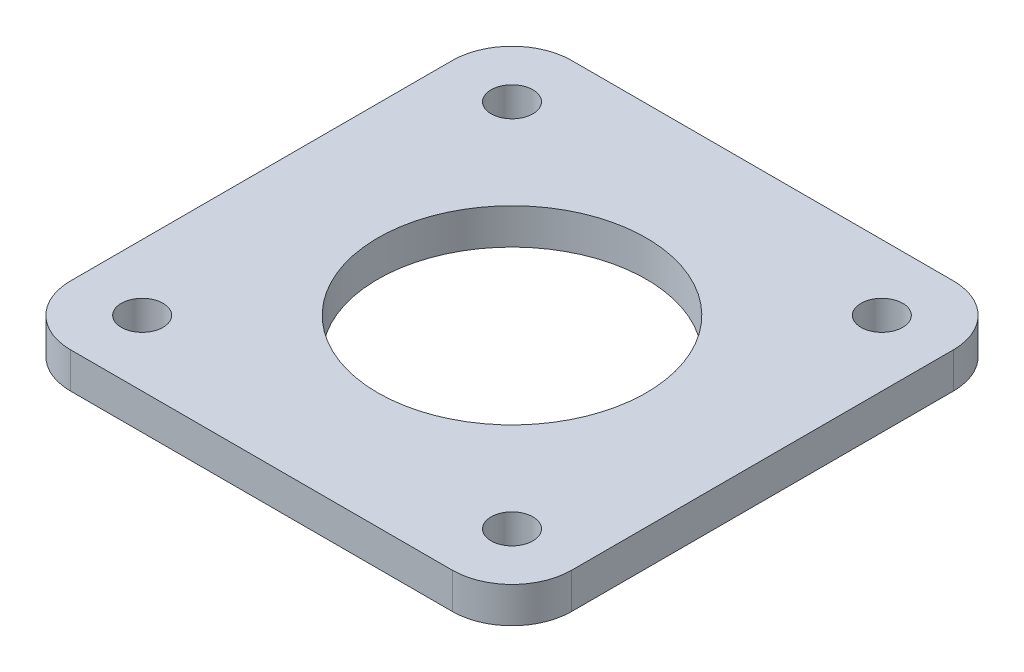
ISO-10303-21;
HEADER;
FILE_DESCRIPTION(('STEP AP214'),'2;1');
FILE_NAME('part.step','',(''),(''),'','','');
FILE_SCHEMA(('AUTOMOTIVE_DESIGN { 1 0 10303 214 1 1 1 1 }'));
ENDSEC;
DATA;
#1=APPLICATION_CONTEXT('core data for automotive mechanical design processes');
#2=APPLICATION_PROTOCOL_DEFINITION('international standard','automotive_design',2000,#1);
#3=PRODUCT_CONTEXT('',#1,'mechanical');
#4=PRODUCT('Part','Part','',(#3));
#5=PRODUCT_RELATED_PRODUCT_CATEGORY('part','',(#4));
#6=PRODUCT_DEFINITION_FORMATION('','',#4);
#7=PRODUCT_DEFINITION_CONTEXT('part definition',#1,'design');
#8=PRODUCT_DEFINITION('design','',#6,#7);
#9=PRODUCT_DEFINITION_SHAPE('','',#8);
#10=(LENGTH_UNIT() NAMED_UNIT(*) SI_UNIT(.MILLI.,.METRE.));
#11=(NAMED_UNIT(*) PLANE_ANGLE_UNIT() SI_UNIT($,.RADIAN.));
#12=(NAMED_UNIT(*) SI_UNIT($,.STERADIAN.) SOLID_ANGLE_UNIT());
#13=UNCERTAINTY_MEASURE_WITH_UNIT(LENGTH_MEASURE(1.E-05),#10,'distance_accuracy_value','');
#14=(GEOMETRIC_REPRESENTATION_CONTEXT(3) GLOBAL_UNCERTAINTY_ASSIGNED_CONTEXT((#13)) GLOBAL_UNIT_ASSIGNED_CONTEXT((#10,
#11,#12)) REPRESENTATION_CONTEXT('',''));
#15=CARTESIAN_POINT('',(0.,0.,0.));
#16=DIRECTION('',(0.,0.,1.));
#17=DIRECTION('',(1.,0.,0.));
#18=AXIS2_PLACEMENT_3D('',#15,#16,#17);
#19=CARTESIAN_POINT('',(21.,3.,-21.));
#20=DIRECTION('',(-1.,0.,0.));
#21=DIRECTION('',(0.,0.,1.));
#22=AXIS2_PLACEMENT_3D('',#19,#20,#21);
#23=PLANE('',#22);
#24=DIRECTION('',(0.,0.,-1.));
#25=VECTOR('',#24,1.);
#26=CARTESIAN_POINT('',(21.,3.,-21.));
#27=LINE('',#26,#25);
#28=CARTESIAN_POINT('',(21.,3.,16.));
#29=VERTEX_POINT('',#28);
#30=CARTESIAN_POINT('',(21.,3.,-16.));
#31=VERTEX_POINT('',#30);
#32=EDGE_CURVE('E121',#29,#31,#27,.T.);
#33=ORIENTED_EDGE('',*,*,#32,.F.);
#34=DIRECTION('',(0.,-1.,0.));
#35=VECTOR('',#34,1.);
#36=CARTESIAN_POINT('',(21.,3.,16.));
#37=LINE('',#36,#35);
#38=CARTESIAN_POINT('',(21.,0.,16.));
#39=VERTEX_POINT('',#38);
#40=EDGE_CURVE('E106',#29,#39,#37,.T.);
#41=ORIENTED_EDGE('',*,*,#40,.T.);
#42=DIRECTION('',(0.,0.,-1.));
#43=VECTOR('',#42,1.);
#44=CARTESIAN_POINT('',(21.,0.,-21.));
#45=LINE('',#44,#43);
#46=CARTESIAN_POINT('',(21.,0.,-16.));
#47=VERTEX_POINT('',#46);
#48=EDGE_CURVE('E118',#39,#47,#45,.T.);
#49=ORIENTED_EDGE('',*,*,#48,.T.);
#50=DIRECTION('',(0.,-1.,0.));
#51=VECTOR('',#50,1.);
#52=CARTESIAN_POINT('',(21.,3.,-16.));
#53=LINE('',#52,#51);
#54=EDGE_CURVE('E123',#47,#31,#53,.F.);
#55=ORIENTED_EDGE('',*,*,#54,.T.);
#56=EDGE_LOOP('',(#33,#41,#49,#55));
#57=FACE_BOUND('',#56,.T.);
#58=ADVANCED_FACE('F36',(#57),#23,.F.);
#59=CARTESIAN_POINT('',(-21.,3.,-21.));
#60=DIRECTION('',(0.,0.,1.));
#61=DIRECTION('',(1.,0.,0.));
#62=AXIS2_PLACEMENT_3D('',#59,#60,#61);
#63=PLANE('',#62);
#64=DIRECTION('',(-1.,0.,0.));
#65=VECTOR('',#64,1.);
#66=CARTESIAN_POINT('',(-21.,3.,-21.));
#67=LINE('',#66,#65);
#68=CARTESIAN_POINT('',(16.,3.,-21.));
#69=VERTEX_POINT('',#68);
#70=CARTESIAN_POINT('',(-16.,3.,-21.));
#71=VERTEX_POINT('',#70);
#72=EDGE_CURVE('E167',#69,#71,#67,.T.);
#73=ORIENTED_EDGE('',*,*,#72,.F.);
#74=DIRECTION('',(0.,-1.,0.));
#75=VECTOR('',#74,1.);
#76=CARTESIAN_POINT('',(16.,3.,-21.));
#77=LINE('',#76,#75);
#78=CARTESIAN_POINT('',(16.,0.,-21.));
#79=VERTEX_POINT('',#78);
#80=EDGE_CURVE('E160',#69,#79,#77,.T.);
#81=ORIENTED_EDGE('',*,*,#80,.T.);
#82=DIRECTION('',(-1.,0.,0.));
#83=VECTOR('',#82,1.);
#84=CARTESIAN_POINT('',(-21.,0.,-21.));
#85=LINE('',#84,#83);
#86=CARTESIAN_POINT('',(-16.,0.,-21.));
#87=VERTEX_POINT('',#86);
#88=EDGE_CURVE('E127',#79,#87,#85,.T.);
#89=ORIENTED_EDGE('',*,*,#88,.T.);
#90=DIRECTION('',(0.,-1.,0.));
#91=VECTOR('',#90,1.);
#92=CARTESIAN_POINT('',(-16.,3.,-21.));
#93=LINE('',#92,#91);
#94=EDGE_CURVE('E158',#87,#71,#93,.F.);
#95=ORIENTED_EDGE('',*,*,#94,.T.);
#96=EDGE_LOOP('',(#73,#81,#89,#95));
#97=FACE_BOUND('',#96,.T.);
#98=ADVANCED_FACE('F165',(#97),#63,.F.);
#99=CARTESIAN_POINT('',(-21.,3.,-21.));
#100=DIRECTION('',(1.,0.,0.));
#101=DIRECTION('',(0.,0.,-1.));
#102=AXIS2_PLACEMENT_3D('',#99,#100,#101);
#103=PLANE('',#102);
#104=DIRECTION('',(0.,0.,1.));
#105=VECTOR('',#104,1.);
#106=CARTESIAN_POINT('',(-21.,3.,-21.));
#107=LINE('',#106,#105);
#108=CARTESIAN_POINT('',(-21.,3.,-16.));
#109=VERTEX_POINT('',#108);
#110=CARTESIAN_POINT('',(-21.,3.,16.));
#111=VERTEX_POINT('',#110);
#112=EDGE_CURVE('E175',#109,#111,#107,.T.);
#113=ORIENTED_EDGE('',*,*,#112,.F.);
#114=DIRECTION('',(0.,-1.,0.));
#115=VECTOR('',#114,1.);
#116=CARTESIAN_POINT('',(-21.,3.,-16.));
#117=LINE('',#116,#115);
#118=CARTESIAN_POINT('',(-21.,0.,-16.));
#119=VERTEX_POINT('',#118);
#120=EDGE_CURVE('E11',#109,#119,#117,.T.);
#121=ORIENTED_EDGE('',*,*,#120,.T.);
#122=DIRECTION('',(0.,0.,1.));
#123=VECTOR('',#122,1.);
#124=CARTESIAN_POINT('',(-21.,0.,-21.));
#125=LINE('',#124,#123);
#126=CARTESIAN_POINT('',(-21.,0.,16.));
#127=VERTEX_POINT('',#126);
#128=EDGE_CURVE('E131',#119,#127,#125,.T.);
#129=ORIENTED_EDGE('',*,*,#128,.T.);
#130=DIRECTION('',(0.,-1.,0.));
#131=VECTOR('',#130,1.);
#132=CARTESIAN_POINT('',(-21.,3.,16.));
#133=LINE('',#132,#131);
#134=EDGE_CURVE('E44',#127,#111,#133,.F.);
#135=ORIENTED_EDGE('',*,*,#134,.T.);
#136=EDGE_LOOP('',(#113,#121,#129,#135));
#137=FACE_BOUND('',#136,.T.);
#138=ADVANCED_FACE('F174',(#137),#103,.F.);
#139=CARTESIAN_POINT('',(-21.,3.,21.));
#140=DIRECTION('',(0.,0.,-1.));
#141=DIRECTION('',(-1.,0.,0.));
#142=AXIS2_PLACEMENT_3D('',#139,#140,#141);
#143=PLANE('',#142);
#144=DIRECTION('',(1.,0.,0.));
#145=VECTOR('',#144,1.);
#146=CARTESIAN_POINT('',(-21.,0.,21.));
#147=LINE('',#146,#145);
#148=CARTESIAN_POINT('',(-16.,0.,21.));
#149=VERTEX_POINT('',#148);
#150=CARTESIAN_POINT('',(16.,0.,21.));
#151=VERTEX_POINT('',#150);
#152=EDGE_CURVE('E141',#149,#151,#147,.T.);
#153=ORIENTED_EDGE('',*,*,#152,.T.);
#154=DIRECTION('',(0.,-1.,0.));
#155=VECTOR('',#154,1.);
#156=CARTESIAN_POINT('',(16.,3.,21.));
#157=LINE('',#156,#155);
#158=CARTESIAN_POINT('',(16.,3.,21.));
#159=VERTEX_POINT('',#158);
#160=EDGE_CURVE('E107',#151,#159,#157,.F.);
#161=ORIENTED_EDGE('',*,*,#160,.T.);
#162=DIRECTION('',(1.,0.,0.));
#163=VECTOR('',#162,1.);
#164=CARTESIAN_POINT('',(-21.,3.,21.));
#165=LINE('',#164,#163);
#166=CARTESIAN_POINT('',(-16.,3.,21.));
#167=VERTEX_POINT('',#166);
#168=EDGE_CURVE('E137',#167,#159,#165,.T.);
#169=ORIENTED_EDGE('',*,*,#168,.F.);
#170=DIRECTION('',(0.,-1.,0.));
#171=VECTOR('',#170,1.);
#172=CARTESIAN_POINT('',(-16.,3.,21.));
#173=LINE('',#172,#171);
#174=EDGE_CURVE('E112',#167,#149,#173,.T.);
#175=ORIENTED_EDGE('',*,*,#174,.T.);
#176=EDGE_LOOP('',(#153,#161,#169,#175));
#177=FACE_BOUND('',#176,.T.);
#178=ADVANCED_FACE('F213',(#177),#143,.F.);
#179=CARTESIAN_POINT('',(0.,3.,0.));
#180=DIRECTION('',(0.,1.,0.));
#181=DIRECTION('',(0.,0.,1.));
#182=AXIS2_PLACEMENT_3D('',#179,#180,#181);
#183=PLANE('',#182);
#184=CARTESIAN_POINT('',(15.5,3.,15.5));
#185=DIRECTION('',(0.,1.,0.));
#186=DIRECTION('',(0.,0.,1.));
#187=AXIS2_PLACEMENT_3D('',#184,#185,#186);
#188=CIRCLE('',#187,1.75);
#189=CARTESIAN_POINT('',(15.5,3.,17.25));
#190=VERTEX_POINT('',#189);
#191=EDGE_CURVE('E187',#190,#190,#188,.T.);
#192=ORIENTED_EDGE('',*,*,#191,.F.);
#193=EDGE_LOOP('',(#192));
#194=FACE_BOUND('',#193,.T.);
#195=CARTESIAN_POINT('',(-15.5,3.,15.5));
#196=DIRECTION('',(0.,1.,0.));
#197=DIRECTION('',(0.,0.,1.));
#198=AXIS2_PLACEMENT_3D('',#195,#196,#197);
#199=CIRCLE('',#198,1.75);
#200=CARTESIAN_POINT('',(-15.5,3.,17.25));
#201=VERTEX_POINT('',#200);
#202=EDGE_CURVE('E193',#201,#201,#199,.T.);
#203=ORIENTED_EDGE('',*,*,#202,.F.);
#204=EDGE_LOOP('',(#203));
#205=FACE_BOUND('',#204,.T.);
#206=CARTESIAN_POINT('',(0.,3.,0.));
#207=DIRECTION('',(0.,1.,0.));
#208=DIRECTION('',(0.,0.,1.));
#209=AXIS2_PLACEMENT_3D('',#206,#207,#208);
#210=CIRCLE('',#209,11.25);
#211=CARTESIAN_POINT('',(0.,3.,11.25));
#212=VERTEX_POINT('',#211);
#213=EDGE_CURVE('E199',#212,#212,#210,.T.);
#214=ORIENTED_EDGE('',*,*,#213,.F.);
#215=EDGE_LOOP('',(#214));
#216=FACE_BOUND('',#215,.T.);
#217=CARTESIAN_POINT('',(15.5,3.,-15.5));
#218=DIRECTION('',(0.,1.,0.));
#219=DIRECTION('',(0.,0.,1.));
#220=AXIS2_PLACEMENT_3D('',#217,#218,#219);
#221=CIRCLE('',#220,1.75);
#222=CARTESIAN_POINT('',(15.5,3.,-13.75));
#223=VERTEX_POINT('',#222);
#224=EDGE_CURVE('E182',#223,#223,#221,.T.);
#225=ORIENTED_EDGE('',*,*,#224,.F.);
#226=EDGE_LOOP('',(#225));
#227=FACE_BOUND('',#226,.T.);
#228=CARTESIAN_POINT('',(-15.5,3.,-15.5));
#229=DIRECTION('',(0.,1.,0.));
#230=DIRECTION('',(0.,0.,1.));
#231=AXIS2_PLACEMENT_3D('',#228,#229,#230);
#232=CIRCLE('',#231,1.75);
#233=CARTESIAN_POINT('',(-15.5,3.,-13.75));
#234=VERTEX_POINT('',#233);
#235=EDGE_CURVE('E134',#234,#234,#232,.T.);
#236=ORIENTED_EDGE('',*,*,#235,.F.);
#237=EDGE_LOOP('',(#236));
#238=FACE_BOUND('',#237,.T.);
#239=ORIENTED_EDGE('',*,*,#168,.T.);
#240=CARTESIAN_POINT('',(16.,3.,16.));
#241=DIRECTION('',(0.,1.,0.));
#242=DIRECTION('',(0.,0.,1.));
#243=AXIS2_PLACEMENT_3D('',#240,#241,#242);
#244=CIRCLE('',#243,5.);
#245=EDGE_CURVE('E156',#159,#29,#244,.T.);
#246=ORIENTED_EDGE('',*,*,#245,.T.);
#247=ORIENTED_EDGE('',*,*,#32,.T.);
#248=CARTESIAN_POINT('',(16.,3.,-16.));
#249=DIRECTION('',(0.,1.,0.));
#250=DIRECTION('',(0.,0.,1.));
#251=AXIS2_PLACEMENT_3D('',#248,#249,#250);
#252=CIRCLE('',#251,5.);
#253=EDGE_CURVE('E154',#31,#69,#252,.T.);
#254=ORIENTED_EDGE('',*,*,#253,.T.);
#255=ORIENTED_EDGE('',*,*,#72,.T.);
#256=CARTESIAN_POINT('',(-16.,3.,-16.));
#257=DIRECTION('',(0.,1.,0.));
#258=DIRECTION('',(0.,0.,1.));
#259=AXIS2_PLACEMENT_3D('',#256,#257,#258);
#260=CIRCLE('',#259,5.);
#261=EDGE_CURVE('E57',#71,#109,#260,.T.);
#262=ORIENTED_EDGE('',*,*,#261,.T.);
#263=ORIENTED_EDGE('',*,*,#112,.T.);
#264=CARTESIAN_POINT('',(-16.,3.,16.));
#265=DIRECTION('',(0.,1.,0.));
#266=DIRECTION('',(0.,0.,1.));
#267=AXIS2_PLACEMENT_3D('',#264,#265,#266);
#268=CIRCLE('',#267,5.);
#269=EDGE_CURVE('E151',#111,#167,#268,.T.);
#270=ORIENTED_EDGE('',*,*,#269,.T.);
#271=EDGE_LOOP('',(#239,#246,#247,#254,#255,#262,#263,#270));
#272=FACE_BOUND('',#271,.T.);
#273=ADVANCED_FACE('F210',(#194,#205,#216,#227,#238,#272),#183,.T.);
#274=CARTESIAN_POINT('',(0.,0.,0.));
#275=DIRECTION('',(0.,1.,0.));
#276=DIRECTION('',(0.,0.,1.));
#277=AXIS2_PLACEMENT_3D('',#274,#275,#276);
#278=PLANE('',#277);
#279=CARTESIAN_POINT('',(15.5,0.,15.5));
#280=DIRECTION('',(0.,1.,0.));
#281=DIRECTION('',(0.,0.,1.));
#282=AXIS2_PLACEMENT_3D('',#279,#280,#281);
#283=CIRCLE('',#282,1.75);
#284=CARTESIAN_POINT('',(15.5,0.,17.25));
#285=VERTEX_POINT('',#284);
#286=EDGE_CURVE('E184',#285,#285,#283,.T.);
#287=ORIENTED_EDGE('',*,*,#286,.T.);
#288=EDGE_LOOP('',(#287));
#289=FACE_BOUND('',#288,.T.);
#290=CARTESIAN_POINT('',(-15.5,0.,15.5));
#291=DIRECTION('',(0.,1.,0.));
#292=DIRECTION('',(0.,0.,1.));
#293=AXIS2_PLACEMENT_3D('',#290,#291,#292);
#294=CIRCLE('',#293,1.75);
#295=CARTESIAN_POINT('',(-15.5,0.,17.25));
#296=VERTEX_POINT('',#295);
#297=EDGE_CURVE('E190',#296,#296,#294,.T.);
#298=ORIENTED_EDGE('',*,*,#297,.T.);
#299=EDGE_LOOP('',(#298));
#300=FACE_BOUND('',#299,.T.);
#301=CARTESIAN_POINT('',(0.,0.,0.));
#302=DIRECTION('',(0.,1.,0.));
#303=DIRECTION('',(0.,0.,1.));
#304=AXIS2_PLACEMENT_3D('',#301,#302,#303);
#305=CIRCLE('',#304,11.25);
#306=CARTESIAN_POINT('',(0.,0.,11.25));
#307=VERTEX_POINT('',#306);
#308=EDGE_CURVE('E196',#307,#307,#305,.T.);
#309=ORIENTED_EDGE('',*,*,#308,.T.);
#310=EDGE_LOOP('',(#309));
#311=FACE_BOUND('',#310,.T.);
#312=CARTESIAN_POINT('',(15.5,0.,-15.5));
#313=DIRECTION('',(0.,1.,0.));
#314=DIRECTION('',(0.,0.,1.));
#315=AXIS2_PLACEMENT_3D('',#312,#313,#314);
#316=CIRCLE('',#315,1.75);
#317=CARTESIAN_POINT('',(15.5,0.,-13.75));
#318=VERTEX_POINT('',#317);
#319=EDGE_CURVE('E202',#318,#318,#316,.T.);
#320=ORIENTED_EDGE('',*,*,#319,.T.);
#321=EDGE_LOOP('',(#320));
#322=FACE_BOUND('',#321,.T.);
#323=CARTESIAN_POINT('',(-15.5,0.,-15.5));
#324=DIRECTION('',(0.,1.,0.));
#325=DIRECTION('',(0.,0.,1.));
#326=AXIS2_PLACEMENT_3D('',#323,#324,#325);
#327=CIRCLE('',#326,1.75);
#328=CARTESIAN_POINT('',(-15.5,0.,-13.75));
#329=VERTEX_POINT('',#328);
#330=EDGE_CURVE('E128',#329,#329,#327,.T.);
#331=ORIENTED_EDGE('',*,*,#330,.T.);
#332=EDGE_LOOP('',(#331));
#333=FACE_BOUND('',#332,.T.);
#334=ORIENTED_EDGE('',*,*,#48,.F.);
#335=CARTESIAN_POINT('',(16.,0.,16.));
#336=DIRECTION('',(0.,1.,0.));
#337=DIRECTION('',(0.,0.,1.));
#338=AXIS2_PLACEMENT_3D('',#335,#336,#337);
#339=CIRCLE('',#338,5.);
#340=EDGE_CURVE('E102',#39,#151,#339,.F.);
#341=ORIENTED_EDGE('',*,*,#340,.T.);
#342=ORIENTED_EDGE('',*,*,#152,.F.);
#343=CARTESIAN_POINT('',(-16.,0.,16.));
#344=DIRECTION('',(0.,1.,0.));
#345=DIRECTION('',(0.,0.,1.));
#346=AXIS2_PLACEMENT_3D('',#343,#344,#345);
#347=CIRCLE('',#346,5.);
#348=EDGE_CURVE('E122',#149,#127,#347,.F.);
#349=ORIENTED_EDGE('',*,*,#348,.T.);
#350=ORIENTED_EDGE('',*,*,#128,.F.);
#351=CARTESIAN_POINT('',(-16.,0.,-16.));
#352=DIRECTION('',(0.,1.,0.));
#353=DIRECTION('',(0.,0.,1.));
#354=AXIS2_PLACEMENT_3D('',#351,#352,#353);
#355=CIRCLE('',#354,5.);
#356=EDGE_CURVE('E145',#119,#87,#355,.F.);
#357=ORIENTED_EDGE('',*,*,#356,.T.);
#358=ORIENTED_EDGE('',*,*,#88,.F.);
#359=CARTESIAN_POINT('',(16.,0.,-16.));
#360=DIRECTION('',(0.,1.,0.));
#361=DIRECTION('',(0.,0.,1.));
#362=AXIS2_PLACEMENT_3D('',#359,#360,#361);
#363=CIRCLE('',#362,5.);
#364=EDGE_CURVE('E113',#79,#47,#363,.F.);
#365=ORIENTED_EDGE('',*,*,#364,.T.);
#366=EDGE_LOOP('',(#334,#341,#342,#349,#350,#357,#358,#365));
#367=FACE_BOUND('',#366,.T.);
#368=ADVANCED_FACE('F125',(#289,#300,#311,#322,#333,#367),#278,.F.);
#369=CARTESIAN_POINT('',(-15.5,0.,-15.5));
#370=DIRECTION('',(0.,1.,0.));
#371=DIRECTION('',(0.,0.,1.));
#372=AXIS2_PLACEMENT_3D('',#369,#370,#371);
#373=CYLINDRICAL_SURFACE('',#372,1.75);
#374=ORIENTED_EDGE('',*,*,#330,.F.);
#375=EDGE_LOOP('',(#374));
#376=FACE_BOUND('',#375,.T.);
#377=ORIENTED_EDGE('',*,*,#235,.T.);
#378=EDGE_LOOP('',(#377));
#379=FACE_BOUND('',#378,.T.);
#380=ADVANCED_FACE('F293',(#376,#379),#373,.F.);
#381=CARTESIAN_POINT('',(15.5,0.,-15.5));
#382=DIRECTION('',(0.,1.,0.));
#383=DIRECTION('',(0.,0.,1.));
#384=AXIS2_PLACEMENT_3D('',#381,#382,#383);
#385=CYLINDRICAL_SURFACE('',#384,1.75);
#386=ORIENTED_EDGE('',*,*,#319,.F.);
#387=EDGE_LOOP('',(#386));
#388=FACE_BOUND('',#387,.T.);
#389=ORIENTED_EDGE('',*,*,#224,.T.);
#390=EDGE_LOOP('',(#389));
#391=FACE_BOUND('',#390,.T.);
#392=ADVANCED_FACE('F208',(#388,#391),#385,.F.);
#393=CARTESIAN_POINT('',(0.,0.,0.));
#394=DIRECTION('',(0.,1.,0.));
#395=DIRECTION('',(0.,0.,1.));
#396=AXIS2_PLACEMENT_3D('',#393,#394,#395);
#397=CYLINDRICAL_SURFACE('',#396,11.25);
#398=ORIENTED_EDGE('',*,*,#308,.F.);
#399=EDGE_LOOP('',(#398));
#400=FACE_BOUND('',#399,.T.);
#401=ORIENTED_EDGE('',*,*,#213,.T.);
#402=EDGE_LOOP('',(#401));
#403=FACE_BOUND('',#402,.T.);
#404=ADVANCED_FACE('F276',(#400,#403),#397,.F.);
#405=CARTESIAN_POINT('',(-15.5,0.,15.5));
#406=DIRECTION('',(0.,1.,0.));
#407=DIRECTION('',(0.,0.,1.));
#408=AXIS2_PLACEMENT_3D('',#405,#406,#407);
#409=CYLINDRICAL_SURFACE('',#408,1.75);
#410=ORIENTED_EDGE('',*,*,#297,.F.);
#411=EDGE_LOOP('',(#410));
#412=FACE_BOUND('',#411,.T.);
#413=ORIENTED_EDGE('',*,*,#202,.T.);
#414=EDGE_LOOP('',(#413));
#415=FACE_BOUND('',#414,.T.);
#416=ADVANCED_FACE('F267',(#412,#415),#409,.F.);
#417=CARTESIAN_POINT('',(15.5,0.,15.5));
#418=DIRECTION('',(0.,1.,0.));
#419=DIRECTION('',(0.,0.,1.));
#420=AXIS2_PLACEMENT_3D('',#417,#418,#419);
#421=CYLINDRICAL_SURFACE('',#420,1.75);
#422=ORIENTED_EDGE('',*,*,#286,.F.);
#423=EDGE_LOOP('',(#422));
#424=FACE_BOUND('',#423,.T.);
#425=ORIENTED_EDGE('',*,*,#191,.T.);
#426=EDGE_LOOP('',(#425));
#427=FACE_BOUND('',#426,.T.);
#428=ADVANCED_FACE('F236',(#424,#427),#421,.F.);
#429=CARTESIAN_POINT('',(16.,3.,16.));
#430=DIRECTION('',(0.,-1.,0.));
#431=DIRECTION('',(0.,0.,-1.));
#432=AXIS2_PLACEMENT_3D('',#429,#430,#431);
#433=CYLINDRICAL_SURFACE('',#432,5.);
#434=ORIENTED_EDGE('',*,*,#245,.F.);
#435=ORIENTED_EDGE('',*,*,#160,.F.);
#436=ORIENTED_EDGE('',*,*,#340,.F.);
#437=ORIENTED_EDGE('',*,*,#40,.F.);
#438=EDGE_LOOP('',(#434,#435,#436,#437));
#439=FACE_BOUND('',#438,.T.);
#440=ADVANCED_FACE('F105',(#439),#433,.T.);
#441=CARTESIAN_POINT('',(16.,3.,-16.));
#442=DIRECTION('',(0.,-1.,0.));
#443=DIRECTION('',(0.,0.,-1.));
#444=AXIS2_PLACEMENT_3D('',#441,#442,#443);
#445=CYLINDRICAL_SURFACE('',#444,5.);
#446=ORIENTED_EDGE('',*,*,#253,.F.);
#447=ORIENTED_EDGE('',*,*,#54,.F.);
#448=ORIENTED_EDGE('',*,*,#364,.F.);
#449=ORIENTED_EDGE('',*,*,#80,.F.);
#450=EDGE_LOOP('',(#446,#447,#448,#449));
#451=FACE_BOUND('',#450,.T.);
#452=ADVANCED_FACE('F225',(#451),#445,.T.);
#453=CARTESIAN_POINT('',(-16.,3.,-16.));
#454=DIRECTION('',(0.,-1.,0.));
#455=DIRECTION('',(0.,0.,-1.));
#456=AXIS2_PLACEMENT_3D('',#453,#454,#455);
#457=CYLINDRICAL_SURFACE('',#456,5.);
#458=ORIENTED_EDGE('',*,*,#261,.F.);
#459=ORIENTED_EDGE('',*,*,#94,.F.);
#460=ORIENTED_EDGE('',*,*,#356,.F.);
#461=ORIENTED_EDGE('',*,*,#120,.F.);
#462=EDGE_LOOP('',(#458,#459,#460,#461));
#463=FACE_BOUND('',#462,.T.);
#464=ADVANCED_FACE('F173',(#463),#457,.T.);
#465=CARTESIAN_POINT('',(-16.,3.,16.));
#466=DIRECTION('',(0.,-1.,0.));
#467=DIRECTION('',(0.,0.,-1.));
#468=AXIS2_PLACEMENT_3D('',#465,#466,#467);
#469=CYLINDRICAL_SURFACE('',#468,5.);
#470=ORIENTED_EDGE('',*,*,#269,.F.);
#471=ORIENTED_EDGE('',*,*,#134,.F.);
#472=ORIENTED_EDGE('',*,*,#348,.F.);
#473=ORIENTED_EDGE('',*,*,#174,.F.);
#474=EDGE_LOOP('',(#470,#471,#472,#473));
#475=FACE_BOUND('',#474,.T.);
#476=ADVANCED_FACE('F38',(#475),#469,.T.);
#477=CLOSED_SHELL('',(#58,#98,#138,#178,#273,#368,#380,#392,#404,#416,#428,#440,#452,#464,#476));
#478=MANIFOLD_SOLID_BREP('B2',#477);
#479=ADVANCED_BREP_SHAPE_REPRESENTATION('',(#18,#478),#14);
#480=SHAPE_DEFINITION_REPRESENTATION(#9,#479);
ENDSEC;
END-ISO-10303-21;
